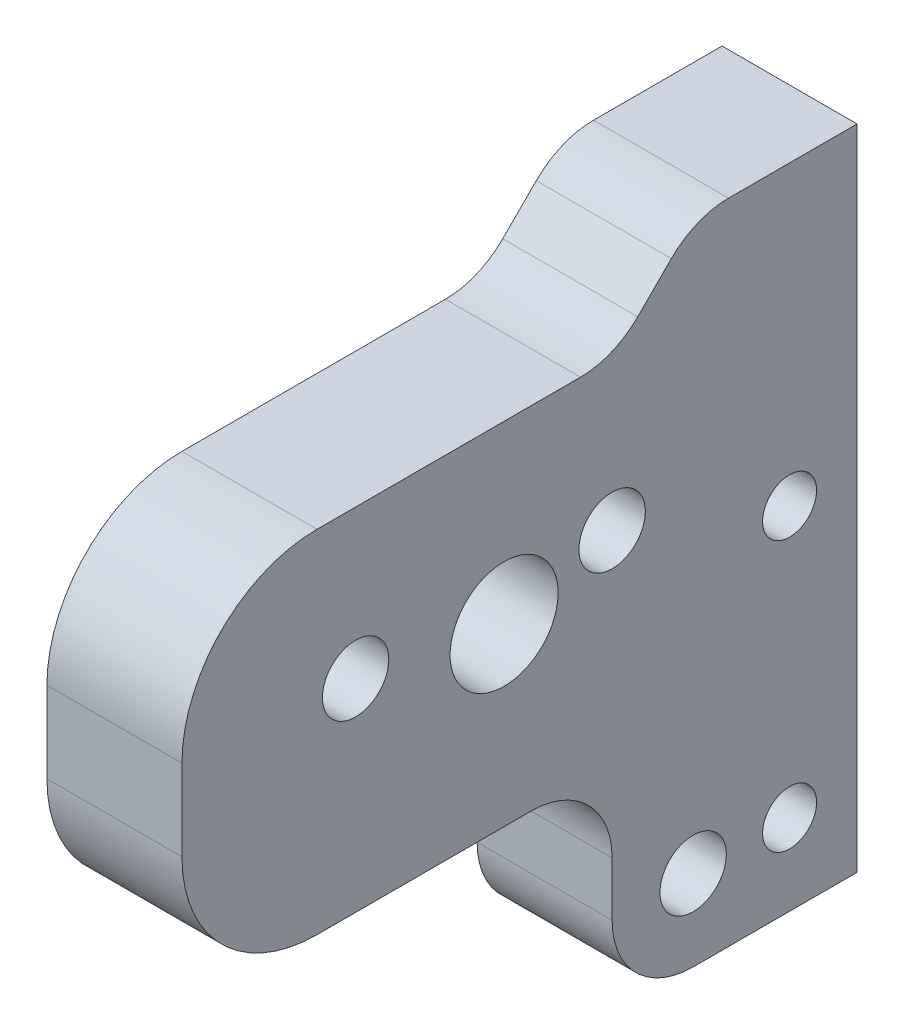
ISO-10303-21;
HEADER;
FILE_DESCRIPTION(('STEP AP214'),'2;1');
FILE_NAME('part.step','',(''),(''),'','','');
FILE_SCHEMA(('AUTOMOTIVE_DESIGN { 1 0 10303 214 1 1 1 1 }'));
ENDSEC;
DATA;
#1=APPLICATION_CONTEXT('core data for automotive mechanical design processes');
#2=APPLICATION_PROTOCOL_DEFINITION('international standard','automotive_design',2000,#1);
#3=PRODUCT_CONTEXT('',#1,'mechanical');
#4=PRODUCT('Part','Part','',(#3));
#5=PRODUCT_RELATED_PRODUCT_CATEGORY('part','',(#4));
#6=PRODUCT_DEFINITION_FORMATION('','',#4);
#7=PRODUCT_DEFINITION_CONTEXT('part definition',#1,'design');
#8=PRODUCT_DEFINITION('design','',#6,#7);
#9=PRODUCT_DEFINITION_SHAPE('','',#8);
#10=(LENGTH_UNIT() NAMED_UNIT(*) SI_UNIT(.MILLI.,.METRE.));
#11=(NAMED_UNIT(*) PLANE_ANGLE_UNIT() SI_UNIT($,.RADIAN.));
#12=(NAMED_UNIT(*) SI_UNIT($,.STERADIAN.) SOLID_ANGLE_UNIT());
#13=UNCERTAINTY_MEASURE_WITH_UNIT(LENGTH_MEASURE(1.E-05),#10,'distance_accuracy_value','');
#14=(GEOMETRIC_REPRESENTATION_CONTEXT(3) GLOBAL_UNCERTAINTY_ASSIGNED_CONTEXT((#13)) GLOBAL_UNIT_ASSIGNED_CONTEXT((#10,
#11,#12)) REPRESENTATION_CONTEXT('',''));
#15=CARTESIAN_POINT('',(0.,0.,0.));
#16=DIRECTION('',(0.,0.,1.));
#17=DIRECTION('',(1.,0.,0.));
#18=AXIS2_PLACEMENT_3D('',#15,#16,#17);
#19=CARTESIAN_POINT('',(5.,-8.729138766001,-7.36228469191367));
#20=DIRECTION('',(1.,0.,0.));
#21=DIRECTION('',(0.,0.,-1.));
#22=AXIS2_PLACEMENT_3D('',#19,#20,#21);
#23=PLANE('',#22);
#24=CARTESIAN_POINT('',(5.,-8.729138766001,-10.9322846915003));
#25=DIRECTION('',(1.,0.,0.));
#26=DIRECTION('',(0.,0.,-1.));
#27=AXIS2_PLACEMENT_3D('',#24,#25,#26);
#28=CIRCLE('',#27,1.);
#29=CARTESIAN_POINT('',(5.,-8.729138766001,-11.9322846915003));
#30=VERTEX_POINT('',#29);
#31=EDGE_CURVE('E293',#30,#30,#28,.T.);
#32=ORIENTED_EDGE('',*,*,#31,.F.);
#33=EDGE_LOOP('',(#32));
#34=FACE_BOUND('',#33,.T.);
#35=CARTESIAN_POINT('',(5.,3.77086123413889,-4.36228469150025));
#36=DIRECTION('',(1.,0.,0.));
#37=DIRECTION('',(0.,0.,-1.));
#38=AXIS2_PLACEMENT_3D('',#35,#36,#37);
#39=CIRCLE('',#38,1.2295);
#40=CARTESIAN_POINT('',(5.,3.77086123413889,-5.59178469150025));
#41=VERTEX_POINT('',#40);
#42=EDGE_CURVE('E276',#41,#41,#39,.T.);
#43=ORIENTED_EDGE('',*,*,#42,.F.);
#44=EDGE_LOOP('',(#43));
#45=FACE_BOUND('',#44,.T.);
#46=CARTESIAN_POINT('',(5.,3.77086123413892,5.13771530849975));
#47=DIRECTION('',(1.,0.,0.));
#48=DIRECTION('',(0.,0.,-1.));
#49=AXIS2_PLACEMENT_3D('',#46,#47,#48);
#50=CIRCLE('',#49,1.2295);
#51=CARTESIAN_POINT('',(5.,3.77086123413892,3.90821530849975));
#52=VERTEX_POINT('',#51);
#53=EDGE_CURVE('E257',#52,#52,#50,.T.);
#54=ORIENTED_EDGE('',*,*,#53,.F.);
#55=EDGE_LOOP('',(#54));
#56=FACE_BOUND('',#55,.T.);
#57=DIRECTION('',(0.,0.,1.));
#58=VECTOR('',#57,1.);
#59=CARTESIAN_POINT('',(5.,9.270861233999,8.56771530849975));
#60=LINE('',#59,#58);
#61=CARTESIAN_POINT('',(5.,9.270861233999,-3.18964400438096));
#62=VERTEX_POINT('',#61);
#63=CARTESIAN_POINT('',(5.,9.270861233999,6.56771530849975));
#64=VERTEX_POINT('',#63);
#65=EDGE_CURVE('E184',#62,#64,#60,.T.);
#66=ORIENTED_EDGE('',*,*,#65,.T.);
#67=CARTESIAN_POINT('',(5.,4.270861233999,6.56771530849975));
#68=DIRECTION('',(1.,0.,0.));
#69=DIRECTION('',(0.,0.,-1.));
#70=AXIS2_PLACEMENT_3D('',#67,#68,#69);
#71=CIRCLE('',#70,5.);
#72=CARTESIAN_POINT('',(5.,4.27086123399899,11.5677153084997));
#73=VERTEX_POINT('',#72);
#74=EDGE_CURVE('E50',#64,#73,#71,.T.);
#75=ORIENTED_EDGE('',*,*,#74,.T.);
#76=DIRECTION('',(0.,-1.,0.));
#77=VECTOR('',#76,1.);
#78=CARTESIAN_POINT('',(5.,-3.729138766001,11.5677153084997));
#79=LINE('',#78,#77);
#80=CARTESIAN_POINT('',(5.,1.27086123399899,11.5677153084997));
#81=VERTEX_POINT('',#80);
#82=EDGE_CURVE('E183',#73,#81,#79,.T.);
#83=ORIENTED_EDGE('',*,*,#82,.T.);
#84=CARTESIAN_POINT('',(5.,1.270861233999,6.56771530849974));
#85=DIRECTION('',(1.,0.,0.));
#86=DIRECTION('',(0.,0.,-1.));
#87=AXIS2_PLACEMENT_3D('',#84,#85,#86);
#88=CIRCLE('',#87,5.);
#89=CARTESIAN_POINT('',(5.,-3.729138766001,6.56771530849974));
#90=VERTEX_POINT('',#89);
#91=EDGE_CURVE('E53',#81,#90,#88,.T.);
#92=ORIENTED_EDGE('',*,*,#91,.T.);
#93=DIRECTION('',(0.,0.,-1.));
#94=VECTOR('',#93,1.);
#95=CARTESIAN_POINT('',(5.,-3.729138766001,-1.36228469191368));
#96=LINE('',#95,#94);
#97=CARTESIAN_POINT('',(5.,-3.729138766001,-1.36228469191368));
#98=VERTEX_POINT('',#97);
#99=EDGE_CURVE('E194',#90,#98,#96,.T.);
#100=ORIENTED_EDGE('',*,*,#99,.T.);
#101=CARTESIAN_POINT('',(5.,-6.729138766001,-1.36228469191368));
#102=DIRECTION('',(-1.,0.,0.));
#103=DIRECTION('',(0.,0.,-1.));
#104=AXIS2_PLACEMENT_3D('',#101,#102,#103);
#105=CIRCLE('',#104,3.);
#106=CARTESIAN_POINT('',(5.,-6.72913876600097,-4.36228469191368));
#107=VERTEX_POINT('',#106);
#108=EDGE_CURVE('E265',#98,#107,#105,.T.);
#109=ORIENTED_EDGE('',*,*,#108,.T.);
#110=DIRECTION('',(0.,-1.,0.));
#111=VECTOR('',#110,1.);
#112=CARTESIAN_POINT('',(5.,-8.729138766001,-4.36228469191368));
#113=LINE('',#112,#111);
#114=CARTESIAN_POINT('',(5.,-8.729138766001,-4.36228469191368));
#115=VERTEX_POINT('',#114);
#116=EDGE_CURVE('E258',#107,#115,#113,.T.);
#117=ORIENTED_EDGE('',*,*,#116,.T.);
#118=CARTESIAN_POINT('',(5.,-8.729138766001,-7.36228469191367));
#119=DIRECTION('',(1.,0.,0.));
#120=DIRECTION('',(0.,0.,-1.));
#121=AXIS2_PLACEMENT_3D('',#118,#119,#120);
#122=CIRCLE('',#121,3.);
#123=CARTESIAN_POINT('',(5.,-11.729138766001,-7.36228469191367));
#124=VERTEX_POINT('',#123);
#125=EDGE_CURVE('E259',#115,#124,#122,.T.);
#126=ORIENTED_EDGE('',*,*,#125,.T.);
#127=DIRECTION('',(0.,0.,-1.));
#128=VECTOR('',#127,1.);
#129=CARTESIAN_POINT('',(5.,-11.729138766001,-13.4322846915003));
#130=LINE('',#129,#128);
#131=CARTESIAN_POINT('',(5.,-11.729138766001,-13.4322846915003));
#132=VERTEX_POINT('',#131);
#133=EDGE_CURVE('E156',#124,#132,#130,.T.);
#134=ORIENTED_EDGE('',*,*,#133,.T.);
#135=DIRECTION('',(0.,1.,0.));
#136=VECTOR('',#135,1.);
#137=CARTESIAN_POINT('',(5.,12.270861233999,-13.4322846915003));
#138=LINE('',#137,#136);
#139=CARTESIAN_POINT('',(5.,12.270861233999,-13.4322846915003));
#140=VERTEX_POINT('',#139);
#141=EDGE_CURVE('E152',#132,#140,#138,.T.);
#142=ORIENTED_EDGE('',*,*,#141,.T.);
#143=DIRECTION('',(0.,0.,1.));
#144=VECTOR('',#143,1.);
#145=CARTESIAN_POINT('',(5.,12.270861233999,-8.67492537861952));
#146=LINE('',#145,#144);
#147=CARTESIAN_POINT('',(5.,12.270861233999,-8.67492537861952));
#148=VERTEX_POINT('',#147);
#149=EDGE_CURVE('E141',#140,#148,#146,.T.);
#150=ORIENTED_EDGE('',*,*,#149,.T.);
#151=CARTESIAN_POINT('',(5.,9.270861233999,-8.67492537861953));
#152=DIRECTION('',(1.,0.,0.));
#153=DIRECTION('',(0.,0.,-1.));
#154=AXIS2_PLACEMENT_3D('',#151,#152,#153);
#155=CIRCLE('',#154,3.00000000000001);
#156=CARTESIAN_POINT('',(5.,11.3921815775586,-6.55360503505988));
#157=VERTEX_POINT('',#156);
#158=EDGE_CURVE('E155',#148,#157,#155,.T.);
#159=ORIENTED_EDGE('',*,*,#158,.T.);
#160=DIRECTION('',(0.,-0.707106781186548,0.707106781186547));
#161=VECTOR('',#160,1.);
#162=CARTESIAN_POINT('',(5.,11.3921815775586,-6.55360503505988));
#163=LINE('',#162,#161);
#164=CARTESIAN_POINT('',(5.,10.1495408904394,-5.3109643479406));
#165=VERTEX_POINT('',#164);
#166=EDGE_CURVE('E250',#157,#165,#163,.T.);
#167=ORIENTED_EDGE('',*,*,#166,.T.);
#168=CARTESIAN_POINT('',(5.,12.270861233999,-3.18964400438097));
#169=DIRECTION('',(-1.,0.,0.));
#170=DIRECTION('',(0.,0.,-1.));
#171=AXIS2_PLACEMENT_3D('',#168,#169,#170);
#172=CIRCLE('',#171,2.99999999999999);
#173=EDGE_CURVE('E268',#165,#62,#172,.T.);
#174=ORIENTED_EDGE('',*,*,#173,.T.);
#175=EDGE_LOOP('',(#66,#75,#83,#92,#100,#109,#117,#126,#134,#142,#150,#159,#167,#174));
#176=FACE_BOUND('',#175,.T.);
#177=CARTESIAN_POINT('',(5.,2.770861233999,-0.36228469150025));
#178=DIRECTION('',(1.,0.,0.));
#179=DIRECTION('',(0.,0.,-1.));
#180=AXIS2_PLACEMENT_3D('',#177,#178,#179);
#181=CIRCLE('',#180,2.);
#182=CARTESIAN_POINT('',(5.,2.770861233999,-2.36228469150025));
#183=VERTEX_POINT('',#182);
#184=EDGE_CURVE('E271',#183,#183,#181,.T.);
#185=ORIENTED_EDGE('',*,*,#184,.F.);
#186=EDGE_LOOP('',(#185));
#187=FACE_BOUND('',#186,.T.);
#188=CARTESIAN_POINT('',(5.,-8.729138766001,-7.36228469191367));
#189=DIRECTION('',(1.,0.,0.));
#190=DIRECTION('',(0.,0.,-1.));
#191=AXIS2_PLACEMENT_3D('',#188,#189,#190);
#192=CIRCLE('',#191,1.2295);
#193=CARTESIAN_POINT('',(5.,-8.729138766001,-8.59178469191367));
#194=VERTEX_POINT('',#193);
#195=EDGE_CURVE('E284',#194,#194,#192,.T.);
#196=ORIENTED_EDGE('',*,*,#195,.F.);
#197=EDGE_LOOP('',(#196));
#198=FACE_BOUND('',#197,.T.);
#199=CARTESIAN_POINT('',(5.,1.270861233999,-10.9322846915003));
#200=DIRECTION('',(1.,0.,0.));
#201=DIRECTION('',(0.,0.,-1.));
#202=AXIS2_PLACEMENT_3D('',#199,#200,#201);
#203=CIRCLE('',#202,0.999999999999998);
#204=CARTESIAN_POINT('',(5.,1.270861233999,-11.9322846915002));
#205=VERTEX_POINT('',#204);
#206=EDGE_CURVE('E300',#205,#205,#203,.T.);
#207=ORIENTED_EDGE('',*,*,#206,.F.);
#208=EDGE_LOOP('',(#207));
#209=FACE_BOUND('',#208,.T.);
#210=ADVANCED_FACE('F39',(#34,#45,#56,#176,#187,#198,#209),#23,.T.);
#211=CARTESIAN_POINT('',(0.,-8.729138766001,-7.36228469191367));
#212=DIRECTION('',(1.,0.,0.));
#213=DIRECTION('',(0.,0.,-1.));
#214=AXIS2_PLACEMENT_3D('',#211,#212,#213);
#215=PLANE('',#214);
#216=DIRECTION('',(0.,-1.,0.));
#217=VECTOR('',#216,1.);
#218=CARTESIAN_POINT('',(0.,-3.729138766001,11.5677153084997));
#219=LINE('',#218,#217);
#220=CARTESIAN_POINT('',(0.,4.27086123399899,11.5677153084997));
#221=VERTEX_POINT('',#220);
#222=CARTESIAN_POINT('',(0.,1.27086123399899,11.5677153084997));
#223=VERTEX_POINT('',#222);
#224=EDGE_CURVE('E205',#221,#223,#219,.T.);
#225=ORIENTED_EDGE('',*,*,#224,.F.);
#226=CARTESIAN_POINT('',(0.,4.270861233999,6.56771530849975));
#227=DIRECTION('',(1.,0.,0.));
#228=DIRECTION('',(0.,0.,-1.));
#229=AXIS2_PLACEMENT_3D('',#226,#227,#228);
#230=CIRCLE('',#229,5.);
#231=CARTESIAN_POINT('',(0.,9.270861233999,6.56771530849975));
#232=VERTEX_POINT('',#231);
#233=EDGE_CURVE('E177',#221,#232,#230,.F.);
#234=ORIENTED_EDGE('',*,*,#233,.T.);
#235=DIRECTION('',(0.,0.,1.));
#236=VECTOR('',#235,1.);
#237=CARTESIAN_POINT('',(0.,9.270861233999,11.5677153084998));
#238=LINE('',#237,#236);
#239=CARTESIAN_POINT('',(0.,9.270861233999,-3.18964400438096));
#240=VERTEX_POINT('',#239);
#241=EDGE_CURVE('E199',#240,#232,#238,.T.);
#242=ORIENTED_EDGE('',*,*,#241,.F.);
#243=CARTESIAN_POINT('',(0.,12.270861233999,-3.18964400438097));
#244=DIRECTION('',(-1.,0.,0.));
#245=DIRECTION('',(0.,0.,-1.));
#246=AXIS2_PLACEMENT_3D('',#243,#244,#245);
#247=CIRCLE('',#246,2.99999999999999);
#248=CARTESIAN_POINT('',(0.,10.1495408904394,-5.3109643479406));
#249=VERTEX_POINT('',#248);
#250=EDGE_CURVE('E210',#249,#240,#247,.T.);
#251=ORIENTED_EDGE('',*,*,#250,.F.);
#252=DIRECTION('',(0.,-0.707106781186548,0.707106781186547));
#253=VECTOR('',#252,1.);
#254=CARTESIAN_POINT('',(0.,11.3921815775586,-6.55360503505988));
#255=LINE('',#254,#253);
#256=CARTESIAN_POINT('',(0.,11.3921815775586,-6.55360503505988));
#257=VERTEX_POINT('',#256);
#258=EDGE_CURVE('E212',#257,#249,#255,.T.);
#259=ORIENTED_EDGE('',*,*,#258,.F.);
#260=CARTESIAN_POINT('',(0.,9.270861233999,-8.67492537861953));
#261=DIRECTION('',(1.,0.,0.));
#262=DIRECTION('',(0.,0.,-1.));
#263=AXIS2_PLACEMENT_3D('',#260,#261,#262);
#264=CIRCLE('',#263,3.00000000000001);
#265=CARTESIAN_POINT('',(0.,12.270861233999,-8.67492537861952));
#266=VERTEX_POINT('',#265);
#267=EDGE_CURVE('E249',#266,#257,#264,.T.);
#268=ORIENTED_EDGE('',*,*,#267,.F.);
#269=DIRECTION('',(0.,0.,1.));
#270=VECTOR('',#269,1.);
#271=CARTESIAN_POINT('',(0.,12.270861233999,-8.67492537861952));
#272=LINE('',#271,#270);
#273=CARTESIAN_POINT('',(0.,12.270861233999,-13.4322846915003));
#274=VERTEX_POINT('',#273);
#275=EDGE_CURVE('E252',#274,#266,#272,.T.);
#276=ORIENTED_EDGE('',*,*,#275,.F.);
#277=DIRECTION('',(0.,1.,0.));
#278=VECTOR('',#277,1.);
#279=CARTESIAN_POINT('',(0.,12.270861233999,-13.4322846915003));
#280=LINE('',#279,#278);
#281=CARTESIAN_POINT('',(0.,-11.729138766001,-13.4322846915003));
#282=VERTEX_POINT('',#281);
#283=EDGE_CURVE('E168',#282,#274,#280,.T.);
#284=ORIENTED_EDGE('',*,*,#283,.F.);
#285=DIRECTION('',(0.,0.,-1.));
#286=VECTOR('',#285,1.);
#287=CARTESIAN_POINT('',(0.,-11.729138766001,-13.4322846915003));
#288=LINE('',#287,#286);
#289=CARTESIAN_POINT('',(0.,-11.729138766001,-7.36228469191367));
#290=VERTEX_POINT('',#289);
#291=EDGE_CURVE('E162',#290,#282,#288,.T.);
#292=ORIENTED_EDGE('',*,*,#291,.F.);
#293=CARTESIAN_POINT('',(0.,-8.729138766001,-7.36228469191367));
#294=DIRECTION('',(1.,0.,0.));
#295=DIRECTION('',(0.,0.,-1.));
#296=AXIS2_PLACEMENT_3D('',#293,#294,#295);
#297=CIRCLE('',#296,3.);
#298=CARTESIAN_POINT('',(0.,-8.729138766001,-4.36228469191368));
#299=VERTEX_POINT('',#298);
#300=EDGE_CURVE('E219',#299,#290,#297,.T.);
#301=ORIENTED_EDGE('',*,*,#300,.F.);
#302=DIRECTION('',(0.,-1.,0.));
#303=VECTOR('',#302,1.);
#304=CARTESIAN_POINT('',(0.,-8.729138766001,-4.36228469191368));
#305=LINE('',#304,#303);
#306=CARTESIAN_POINT('',(0.,-6.72913876600097,-4.36228469191368));
#307=VERTEX_POINT('',#306);
#308=EDGE_CURVE('E217',#307,#299,#305,.T.);
#309=ORIENTED_EDGE('',*,*,#308,.F.);
#310=CARTESIAN_POINT('',(0.,-6.729138766001,-1.36228469191368));
#311=DIRECTION('',(-1.,0.,0.));
#312=DIRECTION('',(0.,0.,-1.));
#313=AXIS2_PLACEMENT_3D('',#310,#311,#312);
#314=CIRCLE('',#313,3.);
#315=CARTESIAN_POINT('',(0.,-3.729138766001,-1.36228469191368));
#316=VERTEX_POINT('',#315);
#317=EDGE_CURVE('E216',#316,#307,#314,.T.);
#318=ORIENTED_EDGE('',*,*,#317,.F.);
#319=DIRECTION('',(0.,0.,-1.));
#320=VECTOR('',#319,1.);
#321=CARTESIAN_POINT('',(0.,-3.729138766001,-1.36228469191368));
#322=LINE('',#321,#320);
#323=CARTESIAN_POINT('',(0.,-3.729138766001,6.56771530849974));
#324=VERTEX_POINT('',#323);
#325=EDGE_CURVE('E209',#324,#316,#322,.T.);
#326=ORIENTED_EDGE('',*,*,#325,.F.);
#327=CARTESIAN_POINT('',(0.,1.270861233999,6.56771530849974));
#328=DIRECTION('',(1.,0.,0.));
#329=DIRECTION('',(0.,0.,-1.));
#330=AXIS2_PLACEMENT_3D('',#327,#328,#329);
#331=CIRCLE('',#330,5.);
#332=EDGE_CURVE('E180',#324,#223,#331,.F.);
#333=ORIENTED_EDGE('',*,*,#332,.T.);
#334=EDGE_LOOP('',(#225,#234,#242,#251,#259,#268,#276,#284,#292,#301,#309,#318,#326,#333));
#335=FACE_BOUND('',#334,.T.);
#336=CARTESIAN_POINT('',(0.,3.77086123413892,5.13771530849975));
#337=DIRECTION('',(1.,0.,0.));
#338=DIRECTION('',(0.,0.,-1.));
#339=AXIS2_PLACEMENT_3D('',#336,#337,#338);
#340=CIRCLE('',#339,1.2295);
#341=CARTESIAN_POINT('',(0.,3.77086123413892,3.90821530849975));
#342=VERTEX_POINT('',#341);
#343=EDGE_CURVE('E267',#342,#342,#340,.T.);
#344=ORIENTED_EDGE('',*,*,#343,.T.);
#345=EDGE_LOOP('',(#344));
#346=FACE_BOUND('',#345,.T.);
#347=CARTESIAN_POINT('',(0.,2.770861233999,-0.36228469150025));
#348=DIRECTION('',(1.,0.,0.));
#349=DIRECTION('',(0.,0.,-1.));
#350=AXIS2_PLACEMENT_3D('',#347,#348,#349);
#351=CIRCLE('',#350,2.);
#352=CARTESIAN_POINT('',(0.,2.770861233999,-2.36228469150025));
#353=VERTEX_POINT('',#352);
#354=EDGE_CURVE('E277',#353,#353,#351,.T.);
#355=ORIENTED_EDGE('',*,*,#354,.T.);
#356=EDGE_LOOP('',(#355));
#357=FACE_BOUND('',#356,.T.);
#358=CARTESIAN_POINT('',(0.,3.77086123413889,-4.36228469150025));
#359=DIRECTION('',(1.,0.,0.));
#360=DIRECTION('',(0.,0.,-1.));
#361=AXIS2_PLACEMENT_3D('',#358,#359,#360);
#362=CIRCLE('',#361,1.2295);
#363=CARTESIAN_POINT('',(0.,3.77086123413889,-5.59178469150025));
#364=VERTEX_POINT('',#363);
#365=EDGE_CURVE('E285',#364,#364,#362,.T.);
#366=ORIENTED_EDGE('',*,*,#365,.T.);
#367=EDGE_LOOP('',(#366));
#368=FACE_BOUND('',#367,.T.);
#369=CARTESIAN_POINT('',(0.,-8.729138766001,-7.36228469191367));
#370=DIRECTION('',(1.,0.,0.));
#371=DIRECTION('',(0.,0.,-1.));
#372=AXIS2_PLACEMENT_3D('',#369,#370,#371);
#373=CIRCLE('',#372,1.2295);
#374=CARTESIAN_POINT('',(0.,-8.729138766001,-8.59178469191367));
#375=VERTEX_POINT('',#374);
#376=EDGE_CURVE('E286',#375,#375,#373,.T.);
#377=ORIENTED_EDGE('',*,*,#376,.T.);
#378=EDGE_LOOP('',(#377));
#379=FACE_BOUND('',#378,.T.);
#380=CARTESIAN_POINT('',(0.,-8.729138766001,-10.9322846915003));
#381=DIRECTION('',(1.,0.,0.));
#382=DIRECTION('',(0.,0.,-1.));
#383=AXIS2_PLACEMENT_3D('',#380,#381,#382);
#384=CIRCLE('',#383,1.);
#385=CARTESIAN_POINT('',(0.,-8.729138766001,-11.9322846915003));
#386=VERTEX_POINT('',#385);
#387=EDGE_CURVE('E295',#386,#386,#384,.T.);
#388=ORIENTED_EDGE('',*,*,#387,.T.);
#389=EDGE_LOOP('',(#388));
#390=FACE_BOUND('',#389,.T.);
#391=CARTESIAN_POINT('',(0.,1.270861233999,-10.9322846915003));
#392=DIRECTION('',(1.,0.,0.));
#393=DIRECTION('',(0.,0.,-1.));
#394=AXIS2_PLACEMENT_3D('',#391,#392,#393);
#395=CIRCLE('',#394,0.999999999999998);
#396=CARTESIAN_POINT('',(0.,1.270861233999,-11.9322846915002));
#397=VERTEX_POINT('',#396);
#398=EDGE_CURVE('E297',#397,#397,#395,.T.);
#399=ORIENTED_EDGE('',*,*,#398,.T.);
#400=EDGE_LOOP('',(#399));
#401=FACE_BOUND('',#400,.T.);
#402=ADVANCED_FACE('F200',(#335,#346,#357,#368,#379,#390,#401),#215,.F.);
#403=CARTESIAN_POINT('',(5.,12.270861233999,-13.4322846915003));
#404=DIRECTION('',(0.,0.,1.));
#405=DIRECTION('',(1.,0.,0.));
#406=AXIS2_PLACEMENT_3D('',#403,#404,#405);
#407=PLANE('',#406);
#408=CARTESIAN_POINT('',(2.5,8.770861233999,-13.4322846915003));
#409=DIRECTION('',(0.,0.,-1.));
#410=DIRECTION('',(-1.,0.,0.));
#411=AXIS2_PLACEMENT_3D('',#408,#409,#410);
#412=CIRCLE('',#411,1.25);
#413=CARTESIAN_POINT('',(1.25,8.770861233999,-13.4322846915003));
#414=VERTEX_POINT('',#413);
#415=EDGE_CURVE('E315',#414,#414,#412,.T.);
#416=ORIENTED_EDGE('',*,*,#415,.F.);
#417=EDGE_LOOP('',(#416));
#418=FACE_BOUND('',#417,.T.);
#419=CARTESIAN_POINT('',(2.5,-5.229138766001,-13.4322846915003));
#420=DIRECTION('',(0.,0.,-1.));
#421=DIRECTION('',(-1.,0.,0.));
#422=AXIS2_PLACEMENT_3D('',#419,#420,#421);
#423=CIRCLE('',#422,1.25);
#424=CARTESIAN_POINT('',(1.25,-5.229138766001,-13.4322846915003));
#425=VERTEX_POINT('',#424);
#426=EDGE_CURVE('E307',#425,#425,#423,.T.);
#427=ORIENTED_EDGE('',*,*,#426,.F.);
#428=EDGE_LOOP('',(#427));
#429=FACE_BOUND('',#428,.T.);
#430=ORIENTED_EDGE('',*,*,#283,.T.);
#431=DIRECTION('',(-1.,0.,0.));
#432=VECTOR('',#431,1.);
#433=CARTESIAN_POINT('',(5.,12.270861233999,-13.4322846915003));
#434=LINE('',#433,#432);
#435=EDGE_CURVE('E150',#140,#274,#434,.T.);
#436=ORIENTED_EDGE('',*,*,#435,.F.);
#437=ORIENTED_EDGE('',*,*,#141,.F.);
#438=DIRECTION('',(-1.,0.,0.));
#439=VECTOR('',#438,1.);
#440=CARTESIAN_POINT('',(5.,-11.729138766001,-13.4322846915003));
#441=LINE('',#440,#439);
#442=EDGE_CURVE('E221',#132,#282,#441,.T.);
#443=ORIENTED_EDGE('',*,*,#442,.T.);
#444=EDGE_LOOP('',(#430,#436,#437,#443));
#445=FACE_BOUND('',#444,.T.);
#446=ADVANCED_FACE('F165',(#418,#429,#445),#407,.F.);
#447=CARTESIAN_POINT('',(5.,12.270861233999,-8.67492537861952));
#448=DIRECTION('',(0.,-1.,0.));
#449=DIRECTION('',(0.,0.,-1.));
#450=AXIS2_PLACEMENT_3D('',#447,#448,#449);
#451=PLANE('',#450);
#452=ORIENTED_EDGE('',*,*,#275,.T.);
#453=DIRECTION('',(-1.,0.,0.));
#454=VECTOR('',#453,1.);
#455=CARTESIAN_POINT('',(5.,12.270861233999,-8.67492537861952));
#456=LINE('',#455,#454);
#457=EDGE_CURVE('E148',#148,#266,#456,.T.);
#458=ORIENTED_EDGE('',*,*,#457,.F.);
#459=ORIENTED_EDGE('',*,*,#149,.F.);
#460=ORIENTED_EDGE('',*,*,#435,.T.);
#461=EDGE_LOOP('',(#452,#458,#459,#460));
#462=FACE_BOUND('',#461,.T.);
#463=ADVANCED_FACE('F143',(#462),#451,.F.);
#464=CARTESIAN_POINT('',(5.,9.270861233999,-8.67492537861953));
#465=DIRECTION('',(-1.,0.,0.));
#466=DIRECTION('',(0.,0.,1.));
#467=AXIS2_PLACEMENT_3D('',#464,#465,#466);
#468=CYLINDRICAL_SURFACE('',#467,3.00000000000001);
#469=ORIENTED_EDGE('',*,*,#267,.T.);
#470=DIRECTION('',(-1.,0.,0.));
#471=VECTOR('',#470,1.);
#472=CARTESIAN_POINT('',(5.,11.3921815775586,-6.55360503505988));
#473=LINE('',#472,#471);
#474=EDGE_CURVE('E171',#157,#257,#473,.T.);
#475=ORIENTED_EDGE('',*,*,#474,.F.);
#476=ORIENTED_EDGE('',*,*,#158,.F.);
#477=ORIENTED_EDGE('',*,*,#457,.T.);
#478=EDGE_LOOP('',(#469,#475,#476,#477));
#479=FACE_BOUND('',#478,.T.);
#480=ADVANCED_FACE('F391',(#479),#468,.T.);
#481=CARTESIAN_POINT('',(5.,11.3921815775586,-6.55360503505988));
#482=DIRECTION('',(0.,-0.707106781186547,-0.707106781186548));
#483=DIRECTION('',(0.,0.707106781186548,-0.707106781186547));
#484=AXIS2_PLACEMENT_3D('',#481,#482,#483);
#485=PLANE('',#484);
#486=ORIENTED_EDGE('',*,*,#258,.T.);
#487=DIRECTION('',(-1.,0.,0.));
#488=VECTOR('',#487,1.);
#489=CARTESIAN_POINT('',(5.,10.1495408904394,-5.3109643479406));
#490=LINE('',#489,#488);
#491=EDGE_CURVE('E238',#165,#249,#490,.T.);
#492=ORIENTED_EDGE('',*,*,#491,.F.);
#493=ORIENTED_EDGE('',*,*,#166,.F.);
#494=ORIENTED_EDGE('',*,*,#474,.T.);
#495=EDGE_LOOP('',(#486,#492,#493,#494));
#496=FACE_BOUND('',#495,.T.);
#497=ADVANCED_FACE('F244',(#496),#485,.F.);
#498=CARTESIAN_POINT('',(5.,12.270861233999,-3.18964400438097));
#499=DIRECTION('',(-1.,0.,0.));
#500=DIRECTION('',(0.,0.,1.));
#501=AXIS2_PLACEMENT_3D('',#498,#499,#500);
#502=CYLINDRICAL_SURFACE('',#501,2.99999999999999);
#503=ORIENTED_EDGE('',*,*,#250,.T.);
#504=DIRECTION('',(-1.,0.,0.));
#505=VECTOR('',#504,1.);
#506=CARTESIAN_POINT('',(5.,9.270861233999,-3.18964400438096));
#507=LINE('',#506,#505);
#508=EDGE_CURVE('E207',#62,#240,#507,.T.);
#509=ORIENTED_EDGE('',*,*,#508,.F.);
#510=ORIENTED_EDGE('',*,*,#173,.F.);
#511=ORIENTED_EDGE('',*,*,#491,.T.);
#512=EDGE_LOOP('',(#503,#509,#510,#511));
#513=FACE_BOUND('',#512,.T.);
#514=ADVANCED_FACE('F383',(#513),#502,.F.);
#515=CARTESIAN_POINT('',(5.,9.270861233999,11.5677153084998));
#516=DIRECTION('',(0.,-1.,0.));
#517=DIRECTION('',(0.,0.,-1.));
#518=AXIS2_PLACEMENT_3D('',#515,#516,#517);
#519=PLANE('',#518);
#520=ORIENTED_EDGE('',*,*,#241,.T.);
#521=DIRECTION('',(-1.,0.,0.));
#522=VECTOR('',#521,1.);
#523=CARTESIAN_POINT('',(5.,9.270861233999,6.56771530849975));
#524=LINE('',#523,#522);
#525=EDGE_CURVE('E65',#232,#64,#524,.F.);
#526=ORIENTED_EDGE('',*,*,#525,.T.);
#527=ORIENTED_EDGE('',*,*,#65,.F.);
#528=ORIENTED_EDGE('',*,*,#508,.T.);
#529=EDGE_LOOP('',(#520,#526,#527,#528));
#530=FACE_BOUND('',#529,.T.);
#531=ADVANCED_FACE('F204',(#530),#519,.F.);
#532=CARTESIAN_POINT('',(5.,-3.729138766001,11.5677153084997));
#533=DIRECTION('',(0.,0.,-1.));
#534=DIRECTION('',(0.,1.,0.));
#535=AXIS2_PLACEMENT_3D('',#532,#533,#534);
#536=PLANE('',#535);
#537=ORIENTED_EDGE('',*,*,#82,.F.);
#538=DIRECTION('',(-1.,0.,0.));
#539=VECTOR('',#538,1.);
#540=CARTESIAN_POINT('',(5.,4.27086123399899,11.5677153084997));
#541=LINE('',#540,#539);
#542=EDGE_CURVE('E169',#73,#221,#541,.T.);
#543=ORIENTED_EDGE('',*,*,#542,.T.);
#544=ORIENTED_EDGE('',*,*,#224,.T.);
#545=DIRECTION('',(-1.,0.,0.));
#546=VECTOR('',#545,1.);
#547=CARTESIAN_POINT('',(5.,1.27086123399899,11.5677153084997));
#548=LINE('',#547,#546);
#549=EDGE_CURVE('E170',#223,#81,#548,.F.);
#550=ORIENTED_EDGE('',*,*,#549,.T.);
#551=EDGE_LOOP('',(#537,#543,#544,#550));
#552=FACE_BOUND('',#551,.T.);
#553=ADVANCED_FACE('F186',(#552),#536,.F.);
#554=CARTESIAN_POINT('',(5.,-3.729138766001,-1.36228469191368));
#555=DIRECTION('',(0.,1.,0.));
#556=DIRECTION('',(0.,0.,1.));
#557=AXIS2_PLACEMENT_3D('',#554,#555,#556);
#558=PLANE('',#557);
#559=ORIENTED_EDGE('',*,*,#99,.F.);
#560=DIRECTION('',(-1.,0.,0.));
#561=VECTOR('',#560,1.);
#562=CARTESIAN_POINT('',(5.,-3.729138766001,6.56771530849974));
#563=LINE('',#562,#561);
#564=EDGE_CURVE('E11',#90,#324,#563,.T.);
#565=ORIENTED_EDGE('',*,*,#564,.T.);
#566=ORIENTED_EDGE('',*,*,#325,.T.);
#567=DIRECTION('',(-1.,0.,0.));
#568=VECTOR('',#567,1.);
#569=CARTESIAN_POINT('',(5.,-3.729138766001,-1.36228469191368));
#570=LINE('',#569,#568);
#571=EDGE_CURVE('E234',#98,#316,#570,.T.);
#572=ORIENTED_EDGE('',*,*,#571,.F.);
#573=EDGE_LOOP('',(#559,#565,#566,#572));
#574=FACE_BOUND('',#573,.T.);
#575=ADVANCED_FACE('F376',(#574),#558,.F.);
#576=CARTESIAN_POINT('',(5.,-6.729138766001,-1.36228469191368));
#577=DIRECTION('',(-1.,0.,0.));
#578=DIRECTION('',(0.,0.,1.));
#579=AXIS2_PLACEMENT_3D('',#576,#577,#578);
#580=CYLINDRICAL_SURFACE('',#579,3.);
#581=ORIENTED_EDGE('',*,*,#317,.T.);
#582=DIRECTION('',(-1.,0.,0.));
#583=VECTOR('',#582,1.);
#584=CARTESIAN_POINT('',(5.,-6.72913876600097,-4.36228469191368));
#585=LINE('',#584,#583);
#586=EDGE_CURVE('E233',#107,#307,#585,.T.);
#587=ORIENTED_EDGE('',*,*,#586,.F.);
#588=ORIENTED_EDGE('',*,*,#108,.F.);
#589=ORIENTED_EDGE('',*,*,#571,.T.);
#590=EDGE_LOOP('',(#581,#587,#588,#589));
#591=FACE_BOUND('',#590,.T.);
#592=ADVANCED_FACE('F375',(#591),#580,.F.);
#593=CARTESIAN_POINT('',(5.,-8.729138766001,-4.36228469191368));
#594=DIRECTION('',(0.,0.,-1.));
#595=DIRECTION('',(0.,1.,0.));
#596=AXIS2_PLACEMENT_3D('',#593,#594,#595);
#597=PLANE('',#596);
#598=ORIENTED_EDGE('',*,*,#308,.T.);
#599=DIRECTION('',(-1.,0.,0.));
#600=VECTOR('',#599,1.);
#601=CARTESIAN_POINT('',(5.,-8.729138766001,-4.36228469191368));
#602=LINE('',#601,#600);
#603=EDGE_CURVE('E226',#115,#299,#602,.T.);
#604=ORIENTED_EDGE('',*,*,#603,.F.);
#605=ORIENTED_EDGE('',*,*,#116,.F.);
#606=ORIENTED_EDGE('',*,*,#586,.T.);
#607=EDGE_LOOP('',(#598,#604,#605,#606));
#608=FACE_BOUND('',#607,.T.);
#609=ADVANCED_FACE('F368',(#608),#597,.F.);
#610=CARTESIAN_POINT('',(5.,-8.729138766001,-7.36228469191367));
#611=DIRECTION('',(-1.,0.,0.));
#612=DIRECTION('',(0.,0.,1.));
#613=AXIS2_PLACEMENT_3D('',#610,#611,#612);
#614=CYLINDRICAL_SURFACE('',#613,3.);
#615=ORIENTED_EDGE('',*,*,#300,.T.);
#616=DIRECTION('',(-1.,0.,0.));
#617=VECTOR('',#616,1.);
#618=CARTESIAN_POINT('',(5.,-11.729138766001,-7.36228469191367));
#619=LINE('',#618,#617);
#620=EDGE_CURVE('E222',#124,#290,#619,.T.);
#621=ORIENTED_EDGE('',*,*,#620,.F.);
#622=ORIENTED_EDGE('',*,*,#125,.F.);
#623=ORIENTED_EDGE('',*,*,#603,.T.);
#624=EDGE_LOOP('',(#615,#621,#622,#623));
#625=FACE_BOUND('',#624,.T.);
#626=ADVANCED_FACE('F364',(#625),#614,.T.);
#627=CARTESIAN_POINT('',(5.,-11.729138766001,-13.4322846915003));
#628=DIRECTION('',(0.,1.,0.));
#629=DIRECTION('',(0.,0.,1.));
#630=AXIS2_PLACEMENT_3D('',#627,#628,#629);
#631=PLANE('',#630);
#632=ORIENTED_EDGE('',*,*,#291,.T.);
#633=ORIENTED_EDGE('',*,*,#442,.F.);
#634=ORIENTED_EDGE('',*,*,#133,.F.);
#635=ORIENTED_EDGE('',*,*,#620,.T.);
#636=EDGE_LOOP('',(#632,#633,#634,#635));
#637=FACE_BOUND('',#636,.T.);
#638=ADVANCED_FACE('F363',(#637),#631,.F.);
#639=CARTESIAN_POINT('',(5.,3.77086123413892,5.13771530849975));
#640=DIRECTION('',(-1.,0.,0.));
#641=DIRECTION('',(0.,0.,1.));
#642=AXIS2_PLACEMENT_3D('',#639,#640,#641);
#643=CYLINDRICAL_SURFACE('',#642,1.2295);
#644=ORIENTED_EDGE('',*,*,#53,.T.);
#645=EDGE_LOOP('',(#644));
#646=FACE_BOUND('',#645,.T.);
#647=ORIENTED_EDGE('',*,*,#343,.F.);
#648=EDGE_LOOP('',(#647));
#649=FACE_BOUND('',#648,.T.);
#650=ADVANCED_FACE('F356',(#646,#649),#643,.F.);
#651=CARTESIAN_POINT('',(5.,2.770861233999,-0.36228469150025));
#652=DIRECTION('',(-1.,0.,0.));
#653=DIRECTION('',(0.,0.,1.));
#654=AXIS2_PLACEMENT_3D('',#651,#652,#653);
#655=CYLINDRICAL_SURFACE('',#654,2.);
#656=ORIENTED_EDGE('',*,*,#184,.T.);
#657=EDGE_LOOP('',(#656));
#658=FACE_BOUND('',#657,.T.);
#659=ORIENTED_EDGE('',*,*,#354,.F.);
#660=EDGE_LOOP('',(#659));
#661=FACE_BOUND('',#660,.T.);
#662=ADVANCED_FACE('F454',(#658,#661),#655,.F.);
#663=CARTESIAN_POINT('',(5.,3.77086123413889,-4.36228469150025));
#664=DIRECTION('',(-1.,0.,0.));
#665=DIRECTION('',(0.,0.,1.));
#666=AXIS2_PLACEMENT_3D('',#663,#664,#665);
#667=CYLINDRICAL_SURFACE('',#666,1.2295);
#668=ORIENTED_EDGE('',*,*,#42,.T.);
#669=EDGE_LOOP('',(#668));
#670=FACE_BOUND('',#669,.T.);
#671=ORIENTED_EDGE('',*,*,#365,.F.);
#672=EDGE_LOOP('',(#671));
#673=FACE_BOUND('',#672,.T.);
#674=ADVANCED_FACE('F442',(#670,#673),#667,.F.);
#675=CARTESIAN_POINT('',(5.,-8.729138766001,-7.36228469191367));
#676=DIRECTION('',(-1.,0.,0.));
#677=DIRECTION('',(0.,0.,1.));
#678=AXIS2_PLACEMENT_3D('',#675,#676,#677);
#679=CYLINDRICAL_SURFACE('',#678,1.2295);
#680=ORIENTED_EDGE('',*,*,#195,.T.);
#681=EDGE_LOOP('',(#680));
#682=FACE_BOUND('',#681,.T.);
#683=ORIENTED_EDGE('',*,*,#376,.F.);
#684=EDGE_LOOP('',(#683));
#685=FACE_BOUND('',#684,.T.);
#686=ADVANCED_FACE('F433',(#682,#685),#679,.F.);
#687=CARTESIAN_POINT('',(5.,-8.729138766001,-10.9322846915003));
#688=DIRECTION('',(-1.,0.,0.));
#689=DIRECTION('',(0.,0.,1.));
#690=AXIS2_PLACEMENT_3D('',#687,#688,#689);
#691=CYLINDRICAL_SURFACE('',#690,1.);
#692=ORIENTED_EDGE('',*,*,#31,.T.);
#693=EDGE_LOOP('',(#692));
#694=FACE_BOUND('',#693,.T.);
#695=ORIENTED_EDGE('',*,*,#387,.F.);
#696=EDGE_LOOP('',(#695));
#697=FACE_BOUND('',#696,.T.);
#698=ADVANCED_FACE('F344',(#694,#697),#691,.F.);
#699=CARTESIAN_POINT('',(5.,1.270861233999,-10.9322846915003));
#700=DIRECTION('',(-1.,0.,0.));
#701=DIRECTION('',(0.,0.,1.));
#702=AXIS2_PLACEMENT_3D('',#699,#700,#701);
#703=CYLINDRICAL_SURFACE('',#702,0.999999999999998);
#704=ORIENTED_EDGE('',*,*,#206,.T.);
#705=EDGE_LOOP('',(#704));
#706=FACE_BOUND('',#705,.T.);
#707=ORIENTED_EDGE('',*,*,#398,.F.);
#708=EDGE_LOOP('',(#707));
#709=FACE_BOUND('',#708,.T.);
#710=ADVANCED_FACE('F334',(#706,#709),#703,.F.);
#711=CARTESIAN_POINT('',(2.5,-5.229138766001,-8.43228469150025));
#712=DIRECTION('',(0.,0.,-1.));
#713=DIRECTION('',(-1.,0.,0.));
#714=AXIS2_PLACEMENT_3D('',#711,#712,#713);
#715=CYLINDRICAL_SURFACE('',#714,1.25);
#716=CARTESIAN_POINT('',(2.5,-5.229138766001,-8.43228469150025));
#717=DIRECTION('',(0.,0.,-1.));
#718=DIRECTION('',(-1.,0.,0.));
#719=AXIS2_PLACEMENT_3D('',#716,#717,#718);
#720=CIRCLE('',#719,1.25);
#721=CARTESIAN_POINT('',(1.25,-5.229138766001,-8.43228469150025));
#722=VERTEX_POINT('',#721);
#723=EDGE_CURVE('E306',#722,#722,#720,.T.);
#724=ORIENTED_EDGE('',*,*,#723,.F.);
#725=EDGE_LOOP('',(#724));
#726=FACE_BOUND('',#725,.T.);
#727=ORIENTED_EDGE('',*,*,#426,.T.);
#728=EDGE_LOOP('',(#727));
#729=FACE_BOUND('',#728,.T.);
#730=ADVANCED_FACE('F335',(#726,#729),#715,.F.);
#731=CARTESIAN_POINT('',(2.5,-5.229138766001,-8.43228469150025));
#732=DIRECTION('',(0.,0.,-1.));
#733=DIRECTION('',(-1.,0.,0.));
#734=AXIS2_PLACEMENT_3D('',#731,#732,#733);
#735=PLANE('',#734);
#736=ORIENTED_EDGE('',*,*,#723,.T.);
#737=EDGE_LOOP('',(#736));
#738=FACE_BOUND('',#737,.T.);
#739=ADVANCED_FACE('F324',(#738),#735,.T.);
#740=CARTESIAN_POINT('',(2.5,8.770861233999,-8.43228469150025));
#741=DIRECTION('',(0.,0.,-1.));
#742=DIRECTION('',(-1.,0.,0.));
#743=AXIS2_PLACEMENT_3D('',#740,#741,#742);
#744=CYLINDRICAL_SURFACE('',#743,1.25);
#745=CARTESIAN_POINT('',(2.5,8.770861233999,-8.43228469150025));
#746=DIRECTION('',(0.,0.,-1.));
#747=DIRECTION('',(-1.,0.,0.));
#748=AXIS2_PLACEMENT_3D('',#745,#746,#747);
#749=CIRCLE('',#748,1.25);
#750=CARTESIAN_POINT('',(1.25,8.770861233999,-8.43228469150025));
#751=VERTEX_POINT('',#750);
#752=EDGE_CURVE('E303',#751,#751,#749,.T.);
#753=ORIENTED_EDGE('',*,*,#752,.F.);
#754=EDGE_LOOP('',(#753));
#755=FACE_BOUND('',#754,.T.);
#756=ORIENTED_EDGE('',*,*,#415,.T.);
#757=EDGE_LOOP('',(#756));
#758=FACE_BOUND('',#757,.T.);
#759=ADVANCED_FACE('F318',(#755,#758),#744,.F.);
#760=CARTESIAN_POINT('',(2.5,8.770861233999,-8.43228469150025));
#761=DIRECTION('',(0.,0.,-1.));
#762=DIRECTION('',(-1.,0.,0.));
#763=AXIS2_PLACEMENT_3D('',#760,#761,#762);
#764=PLANE('',#763);
#765=ORIENTED_EDGE('',*,*,#752,.T.);
#766=EDGE_LOOP('',(#765));
#767=FACE_BOUND('',#766,.T.);
#768=ADVANCED_FACE('F319',(#767),#764,.T.);
#769=CARTESIAN_POINT('',(5.,4.270861233999,6.56771530849975));
#770=DIRECTION('',(-1.,0.,0.));
#771=DIRECTION('',(0.,0.,1.));
#772=AXIS2_PLACEMENT_3D('',#769,#770,#771);
#773=CYLINDRICAL_SURFACE('',#772,5.);
#774=ORIENTED_EDGE('',*,*,#74,.F.);
#775=ORIENTED_EDGE('',*,*,#525,.F.);
#776=ORIENTED_EDGE('',*,*,#233,.F.);
#777=ORIENTED_EDGE('',*,*,#542,.F.);
#778=EDGE_LOOP('',(#774,#775,#776,#777));
#779=FACE_BOUND('',#778,.T.);
#780=ADVANCED_FACE('F193',(#779),#773,.T.);
#781=CARTESIAN_POINT('',(5.,1.270861233999,6.56771530849974));
#782=DIRECTION('',(-1.,0.,0.));
#783=DIRECTION('',(0.,0.,1.));
#784=AXIS2_PLACEMENT_3D('',#781,#782,#783);
#785=CYLINDRICAL_SURFACE('',#784,5.);
#786=ORIENTED_EDGE('',*,*,#91,.F.);
#787=ORIENTED_EDGE('',*,*,#549,.F.);
#788=ORIENTED_EDGE('',*,*,#332,.F.);
#789=ORIENTED_EDGE('',*,*,#564,.F.);
#790=EDGE_LOOP('',(#786,#787,#788,#789));
#791=FACE_BOUND('',#790,.T.);
#792=ADVANCED_FACE('F41',(#791),#785,.T.);
#793=CLOSED_SHELL('',(#210,#402,#446,#463,#480,#497,#514,#531,#553,#575,#592,#609,#626,#638,
#650,#662,#674,#686,#698,#710,#730,#739,#759,#768,#780,#792));
#794=MANIFOLD_SOLID_BREP('B2',#793);
#795=ADVANCED_BREP_SHAPE_REPRESENTATION('',(#18,#794),#14);
#796=SHAPE_DEFINITION_REPRESENTATION(#9,#795);
ENDSEC;
END-ISO-10303-21;
